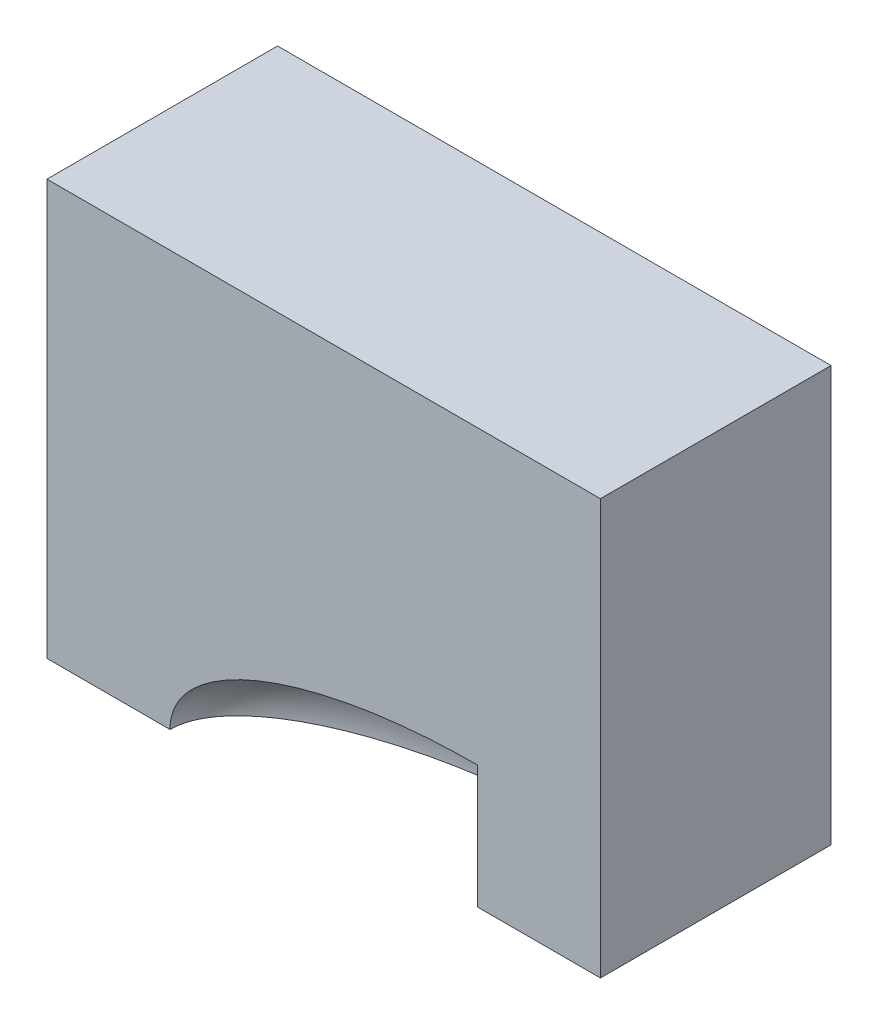
ISO-10303-21;
HEADER;
FILE_DESCRIPTION(('STEP AP214'),'2;1');
FILE_NAME('part.step','',(''),(''),'','','');
FILE_SCHEMA(('AUTOMOTIVE_DESIGN { 1 0 10303 214 1 1 1 1 }'));
ENDSEC;
DATA;
#1=APPLICATION_CONTEXT('core data for automotive mechanical design processes');
#2=APPLICATION_PROTOCOL_DEFINITION('international standard','automotive_design',2000,#1);
#3=PRODUCT_CONTEXT('',#1,'mechanical');
#4=PRODUCT('Part','Part','',(#3));
#5=PRODUCT_RELATED_PRODUCT_CATEGORY('part','',(#4));
#6=PRODUCT_DEFINITION_FORMATION('','',#4);
#7=PRODUCT_DEFINITION_CONTEXT('part definition',#1,'design');
#8=PRODUCT_DEFINITION('design','',#6,#7);
#9=PRODUCT_DEFINITION_SHAPE('','',#8);
#10=(LENGTH_UNIT() NAMED_UNIT(*) SI_UNIT(.MILLI.,.METRE.));
#11=(NAMED_UNIT(*) PLANE_ANGLE_UNIT() SI_UNIT($,.RADIAN.));
#12=(NAMED_UNIT(*) SI_UNIT($,.STERADIAN.) SOLID_ANGLE_UNIT());
#13=UNCERTAINTY_MEASURE_WITH_UNIT(LENGTH_MEASURE(1.E-05),#10,'distance_accuracy_value','');
#14=(GEOMETRIC_REPRESENTATION_CONTEXT(3) GLOBAL_UNCERTAINTY_ASSIGNED_CONTEXT((#13)) GLOBAL_UNIT_ASSIGNED_CONTEXT((#10,
#11,#12)) REPRESENTATION_CONTEXT('',''));
#15=CARTESIAN_POINT('',(0.,0.,0.));
#16=DIRECTION('',(0.,0.,1.));
#17=DIRECTION('',(1.,0.,0.));
#18=AXIS2_PLACEMENT_3D('',#15,#16,#17);
#19=CARTESIAN_POINT('',(0.,0.,38.1));
#20=DIRECTION('',(0.,1.,0.));
#21=DIRECTION('',(0.,0.,1.));
#22=AXIS2_PLACEMENT_3D('',#19,#20,#21);
#23=PLANE('',#22);
#24=CARTESIAN_POINT('',(71.12,0.,38.1));
#25=DIRECTION('',(0.,-1.,0.));
#26=DIRECTION('',(1.,0.,0.));
#27=AXIS2_PLACEMENT_3D('',#24,#25,#26);
#28=ELLIPSE('',#27,50.8,20.32);
#29=CARTESIAN_POINT('',(20.32,0.,38.1));
#30=VERTEX_POINT('',#29);
#31=CARTESIAN_POINT('',(71.12,0.,17.78));
#32=VERTEX_POINT('',#31);
#33=EDGE_CURVE('E98',#30,#32,#28,.T.);
#34=ORIENTED_EDGE('',*,*,#33,.F.);
#35=DIRECTION('',(1.,0.,0.));
#36=VECTOR('',#35,1.);
#37=CARTESIAN_POINT('',(0.,0.,38.1));
#38=LINE('',#37,#36);
#39=CARTESIAN_POINT('',(0.,0.,38.1));
#40=VERTEX_POINT('',#39);
#41=EDGE_CURVE('E86',#40,#30,#38,.T.);
#42=ORIENTED_EDGE('',*,*,#41,.F.);
#43=DIRECTION('',(0.,0.,-1.));
#44=VECTOR('',#43,1.);
#45=CARTESIAN_POINT('',(0.,0.,38.1));
#46=LINE('',#45,#44);
#47=CARTESIAN_POINT('',(0.,0.,0.));
#48=VERTEX_POINT('',#47);
#49=EDGE_CURVE('E128',#40,#48,#46,.T.);
#50=ORIENTED_EDGE('',*,*,#49,.T.);
#51=DIRECTION('',(1.,0.,0.));
#52=VECTOR('',#51,1.);
#53=CARTESIAN_POINT('',(0.,0.,0.));
#54=LINE('',#53,#52);
#55=CARTESIAN_POINT('',(91.44,0.,0.));
#56=VERTEX_POINT('',#55);
#57=EDGE_CURVE('E117',#48,#56,#54,.T.);
#58=ORIENTED_EDGE('',*,*,#57,.T.);
#59=DIRECTION('',(0.,0.,-1.));
#60=VECTOR('',#59,1.);
#61=CARTESIAN_POINT('',(91.44,0.,38.1));
#62=LINE('',#61,#60);
#63=CARTESIAN_POINT('',(91.44,0.,38.1));
#64=VERTEX_POINT('',#63);
#65=EDGE_CURVE('E125',#64,#56,#62,.T.);
#66=ORIENTED_EDGE('',*,*,#65,.F.);
#67=CARTESIAN_POINT('',(71.12,0.,38.1));
#68=VERTEX_POINT('',#67);
#69=EDGE_CURVE('E108',#68,#64,#38,.T.);
#70=ORIENTED_EDGE('',*,*,#69,.F.);
#71=DIRECTION('',(0.,0.,1.));
#72=VECTOR('',#71,1.);
#73=CARTESIAN_POINT('',(71.12,0.,38.1));
#74=LINE('',#73,#72);
#75=EDGE_CURVE('E48',#32,#68,#74,.T.);
#76=ORIENTED_EDGE('',*,*,#75,.F.);
#77=EDGE_LOOP('',(#34,#42,#50,#58,#66,#70,#76));
#78=FACE_BOUND('',#77,.T.);
#79=ADVANCED_FACE('F33',(#78),#23,.F.);
#80=CARTESIAN_POINT('',(0.,0.,38.1));
#81=DIRECTION('',(0.,0.,-1.));
#82=DIRECTION('',(-1.,0.,0.));
#83=AXIS2_PLACEMENT_3D('',#80,#81,#82);
#84=PLANE('',#83);
#85=CARTESIAN_POINT('',(71.12,0.,38.1));
#86=DIRECTION('',(0.,0.,-1.));
#87=DIRECTION('',(1.,0.,0.));
#88=AXIS2_PLACEMENT_3D('',#85,#86,#87);
#89=ELLIPSE('',#88,50.8,20.32);
#90=CARTESIAN_POINT('',(71.12,20.32,38.1));
#91=VERTEX_POINT('',#90);
#92=EDGE_CURVE('E11',#91,#30,#89,.F.);
#93=ORIENTED_EDGE('',*,*,#92,.F.);
#94=DIRECTION('',(0.,1.,0.));
#95=VECTOR('',#94,1.);
#96=CARTESIAN_POINT('',(71.12,0.,38.1));
#97=LINE('',#96,#95);
#98=EDGE_CURVE('E41',#68,#91,#97,.T.);
#99=ORIENTED_EDGE('',*,*,#98,.F.);
#100=ORIENTED_EDGE('',*,*,#69,.T.);
#101=DIRECTION('',(0.,1.,0.));
#102=VECTOR('',#101,1.);
#103=CARTESIAN_POINT('',(91.44,0.,38.1));
#104=LINE('',#103,#102);
#105=CARTESIAN_POINT('',(91.44,68.58,38.1));
#106=VERTEX_POINT('',#105);
#107=EDGE_CURVE('E107',#64,#106,#104,.T.);
#108=ORIENTED_EDGE('',*,*,#107,.T.);
#109=DIRECTION('',(-1.,0.,0.));
#110=VECTOR('',#109,1.);
#111=CARTESIAN_POINT('',(0.,68.58,38.1));
#112=LINE('',#111,#110);
#113=CARTESIAN_POINT('',(0.,68.58,38.1));
#114=VERTEX_POINT('',#113);
#115=EDGE_CURVE('E57',#106,#114,#112,.T.);
#116=ORIENTED_EDGE('',*,*,#115,.T.);
#117=DIRECTION('',(0.,-1.,0.));
#118=VECTOR('',#117,1.);
#119=CARTESIAN_POINT('',(0.,0.,38.1));
#120=LINE('',#119,#118);
#121=EDGE_CURVE('E105',#114,#40,#120,.T.);
#122=ORIENTED_EDGE('',*,*,#121,.T.);
#123=ORIENTED_EDGE('',*,*,#41,.T.);
#124=EDGE_LOOP('',(#93,#99,#100,#108,#116,#122,#123));
#125=FACE_BOUND('',#124,.T.);
#126=ADVANCED_FACE('F103',(#125),#84,.F.);
#127=CARTESIAN_POINT('',(0.,0.,38.1));
#128=DIRECTION('',(1.,0.,0.));
#129=DIRECTION('',(0.,0.,-1.));
#130=AXIS2_PLACEMENT_3D('',#127,#128,#129);
#131=PLANE('',#130);
#132=DIRECTION('',(0.,-1.,0.));
#133=VECTOR('',#132,1.);
#134=CARTESIAN_POINT('',(0.,0.,0.));
#135=LINE('',#134,#133);
#136=CARTESIAN_POINT('',(0.,68.58,0.));
#137=VERTEX_POINT('',#136);
#138=EDGE_CURVE('E101',#137,#48,#135,.T.);
#139=ORIENTED_EDGE('',*,*,#138,.T.);
#140=ORIENTED_EDGE('',*,*,#49,.F.);
#141=ORIENTED_EDGE('',*,*,#121,.F.);
#142=DIRECTION('',(0.,0.,-1.));
#143=VECTOR('',#142,1.);
#144=CARTESIAN_POINT('',(0.,68.58,38.1));
#145=LINE('',#144,#143);
#146=EDGE_CURVE('E114',#114,#137,#145,.T.);
#147=ORIENTED_EDGE('',*,*,#146,.T.);
#148=EDGE_LOOP('',(#139,#140,#141,#147));
#149=FACE_BOUND('',#148,.T.);
#150=ADVANCED_FACE('F35',(#149),#131,.F.);
#151=CARTESIAN_POINT('',(91.44,0.,38.1));
#152=DIRECTION('',(-1.,0.,0.));
#153=DIRECTION('',(0.,0.,1.));
#154=AXIS2_PLACEMENT_3D('',#151,#152,#153);
#155=PLANE('',#154);
#156=DIRECTION('',(0.,1.,0.));
#157=VECTOR('',#156,1.);
#158=CARTESIAN_POINT('',(91.44,0.,0.));
#159=LINE('',#158,#157);
#160=CARTESIAN_POINT('',(91.44,68.58,0.));
#161=VERTEX_POINT('',#160);
#162=EDGE_CURVE('E119',#56,#161,#159,.T.);
#163=ORIENTED_EDGE('',*,*,#162,.T.);
#164=DIRECTION('',(0.,0.,-1.));
#165=VECTOR('',#164,1.);
#166=CARTESIAN_POINT('',(91.44,68.58,38.1));
#167=LINE('',#166,#165);
#168=EDGE_CURVE('E123',#106,#161,#167,.T.);
#169=ORIENTED_EDGE('',*,*,#168,.F.);
#170=ORIENTED_EDGE('',*,*,#107,.F.);
#171=ORIENTED_EDGE('',*,*,#65,.T.);
#172=EDGE_LOOP('',(#163,#169,#170,#171));
#173=FACE_BOUND('',#172,.T.);
#174=ADVANCED_FACE('F135',(#173),#155,.F.);
#175=CARTESIAN_POINT('',(0.,68.58,38.1));
#176=DIRECTION('',(0.,-1.,0.));
#177=DIRECTION('',(0.,0.,-1.));
#178=AXIS2_PLACEMENT_3D('',#175,#176,#177);
#179=PLANE('',#178);
#180=DIRECTION('',(-1.,0.,0.));
#181=VECTOR('',#180,1.);
#182=CARTESIAN_POINT('',(0.,68.58,0.));
#183=LINE('',#182,#181);
#184=EDGE_CURVE('E78',#161,#137,#183,.T.);
#185=ORIENTED_EDGE('',*,*,#184,.T.);
#186=ORIENTED_EDGE('',*,*,#146,.F.);
#187=ORIENTED_EDGE('',*,*,#115,.F.);
#188=ORIENTED_EDGE('',*,*,#168,.T.);
#189=EDGE_LOOP('',(#185,#186,#187,#188));
#190=FACE_BOUND('',#189,.T.);
#191=ADVANCED_FACE('F136',(#190),#179,.F.);
#192=CARTESIAN_POINT('',(0.,0.,0.));
#193=DIRECTION('',(0.,0.,-1.));
#194=DIRECTION('',(-1.,0.,0.));
#195=AXIS2_PLACEMENT_3D('',#192,#193,#194);
#196=PLANE('',#195);
#197=ORIENTED_EDGE('',*,*,#138,.F.);
#198=ORIENTED_EDGE('',*,*,#184,.F.);
#199=ORIENTED_EDGE('',*,*,#162,.F.);
#200=ORIENTED_EDGE('',*,*,#57,.F.);
#201=EDGE_LOOP('',(#197,#198,#199,#200));
#202=FACE_BOUND('',#201,.T.);
#203=ADVANCED_FACE('F140',(#202),#196,.T.);
#204=CARTESIAN_POINT('',(71.12,0.,38.1));
#205=DIRECTION('',(0.,-1.,0.));
#206=DIRECTION('',(1.,0.,0.));
#207=AXIS2_PLACEMENT_3D('',#204,#205,#206);
#208=ELLIPSE('',#207,50.8,20.32);
#209=TRIMMED_CURVE('',#208,(PARAMETER_VALUE(3.14159265358979)),
(PARAMETER_VALUE(6.28318530717959)),.T.,.PARAMETER.);
#210=CARTESIAN_POINT('',(71.12,0.,38.1));
#211=DIRECTION('',(1.,0.,0.));
#212=AXIS1_PLACEMENT('',#210,#211);
#213=SURFACE_OF_REVOLUTION('',#209,#212);
#214=ORIENTED_EDGE('',*,*,#33,.T.);
#215=CARTESIAN_POINT('',(71.12,0.,38.1));
#216=DIRECTION('',(1.,0.,0.));
#217=DIRECTION('',(0.,0.,-1.));
#218=AXIS2_PLACEMENT_3D('',#215,#216,#217);
#219=CIRCLE('',#218,20.32);
#220=EDGE_CURVE('E99',#32,#91,#219,.T.);
#221=ORIENTED_EDGE('',*,*,#220,.T.);
#222=ORIENTED_EDGE('',*,*,#92,.T.);
#223=EDGE_LOOP('',(#214,#221,#222));
#224=FACE_BOUND('',#223,.T.);
#225=ADVANCED_FACE('F97',(#224),#213,.F.);
#226=CARTESIAN_POINT('',(71.12,0.,38.1));
#227=DIRECTION('',(-1.,0.,0.));
#228=DIRECTION('',(0.,0.,1.));
#229=AXIS2_PLACEMENT_3D('',#226,#227,#228);
#230=PLANE('',#229);
#231=ORIENTED_EDGE('',*,*,#75,.T.);
#232=ORIENTED_EDGE('',*,*,#98,.T.);
#233=ORIENTED_EDGE('',*,*,#220,.F.);
#234=EDGE_LOOP('',(#231,#232,#233));
#235=FACE_BOUND('',#234,.T.);
#236=ADVANCED_FACE('F129',(#235),#230,.T.);
#237=CLOSED_SHELL('',(#79,#126,#150,#174,#191,#203,#225,#236));
#238=MANIFOLD_SOLID_BREP('B2',#237);
#239=ADVANCED_BREP_SHAPE_REPRESENTATION('',(#18,#238),#14);
#240=SHAPE_DEFINITION_REPRESENTATION(#9,#239);
ENDSEC;
END-ISO-10303-21;
